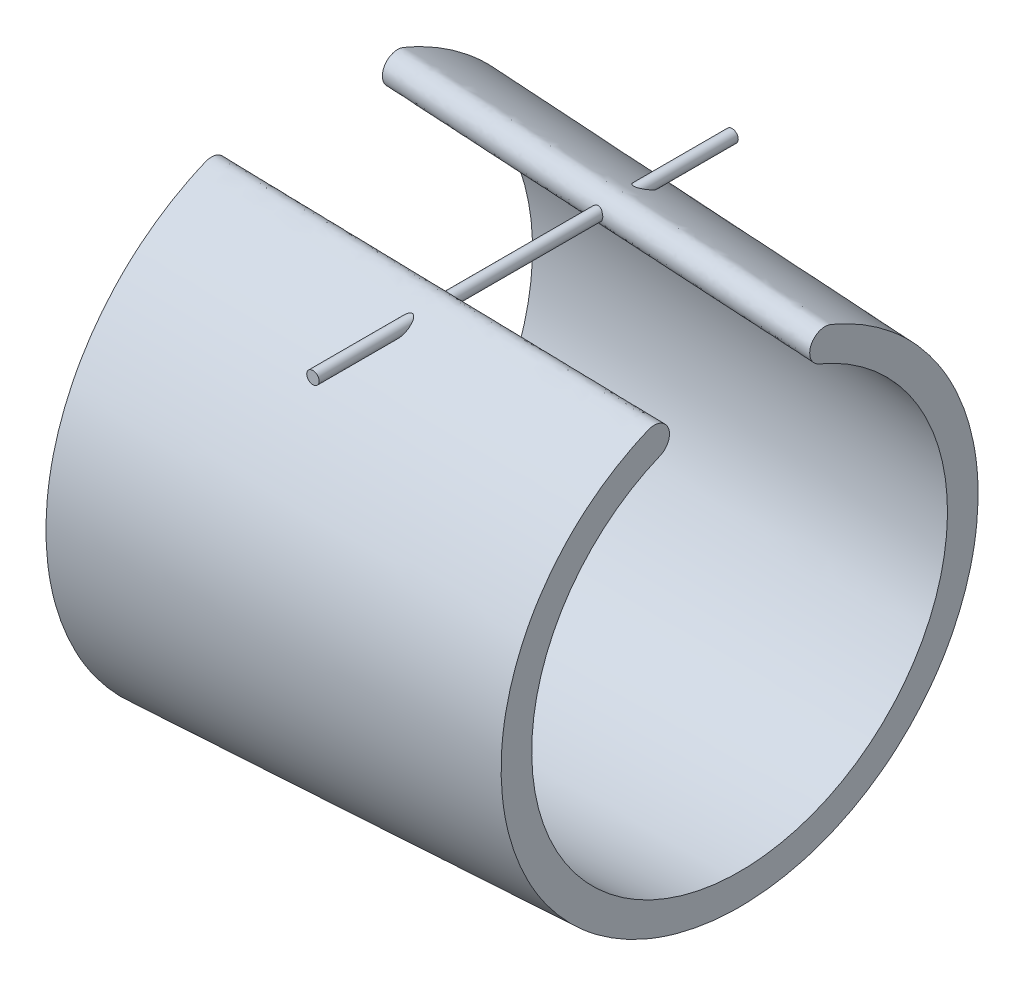
ISO-10303-21;
HEADER;
FILE_DESCRIPTION(('STEP AP214'),'2;1');
FILE_NAME('part.step','',(''),(''),'','','');
FILE_SCHEMA(('AUTOMOTIVE_DESIGN { 1 0 10303 214 1 1 1 1 }'));
ENDSEC;
DATA;
#1=APPLICATION_CONTEXT('core data for automotive mechanical design processes');
#2=APPLICATION_PROTOCOL_DEFINITION('international standard','automotive_design',2000,#1);
#3=PRODUCT_CONTEXT('',#1,'mechanical');
#4=PRODUCT('Part','Part','',(#3));
#5=PRODUCT_RELATED_PRODUCT_CATEGORY('part','',(#4));
#6=PRODUCT_DEFINITION_FORMATION('','',#4);
#7=PRODUCT_DEFINITION_CONTEXT('part definition',#1,'design');
#8=PRODUCT_DEFINITION('design','',#6,#7);
#9=PRODUCT_DEFINITION_SHAPE('','',#8);
#10=(LENGTH_UNIT() NAMED_UNIT(*) SI_UNIT(.MILLI.,.METRE.));
#11=(NAMED_UNIT(*) PLANE_ANGLE_UNIT() SI_UNIT($,.RADIAN.));
#12=(NAMED_UNIT(*) SI_UNIT($,.STERADIAN.) SOLID_ANGLE_UNIT());
#13=UNCERTAINTY_MEASURE_WITH_UNIT(LENGTH_MEASURE(1.E-05),#10,'distance_accuracy_value','');
#14=(GEOMETRIC_REPRESENTATION_CONTEXT(3) GLOBAL_UNCERTAINTY_ASSIGNED_CONTEXT((#13)) GLOBAL_UNIT_ASSIGNED_CONTEXT((#10,
#11,#12)) REPRESENTATION_CONTEXT('',''));
#15=CARTESIAN_POINT('',(0.,0.,0.));
#16=DIRECTION('',(0.,0.,1.));
#17=DIRECTION('',(1.,0.,0.));
#18=AXIS2_PLACEMENT_3D('',#15,#16,#17);
#19=CARTESIAN_POINT('',(13.208,13.1028698678518,12.7));
#20=DIRECTION('',(0.,0.,-1.));
#21=DIRECTION('',(-1.,0.,0.));
#22=AXIS2_PLACEMENT_3D('',#19,#20,#21);
#23=CYLINDRICAL_SURFACE('',#22,0.375547918929717);
#24=CARTESIAN_POINT('',(13.208,13.1028698678518,12.7));
#25=DIRECTION('',(0.,0.,1.));
#26=DIRECTION('',(1.,0.,0.));
#27=AXIS2_PLACEMENT_3D('',#24,#25,#26);
#28=CIRCLE('',#27,0.375547918929717);
#29=CARTESIAN_POINT('',(13.5835479189297,13.1028698678518,12.7));
#30=VERTEX_POINT('',#29);
#31=EDGE_CURVE('E12',#30,#30,#28,.T.);
#32=ORIENTED_EDGE('',*,*,#31,.F.);
#33=EDGE_LOOP('',(#32));
#34=FACE_BOUND('',#33,.T.);
#35=CARTESIAN_POINT('',(13.208,13.1028698678518,-12.7));
#36=DIRECTION('',(0.,0.,1.));
#37=DIRECTION('',(1.,0.,0.));
#38=AXIS2_PLACEMENT_3D('',#35,#36,#37);
#39=CIRCLE('',#38,0.375547918929717);
#40=CARTESIAN_POINT('',(13.5835479189297,13.1028698678518,-12.7));
#41=VERTEX_POINT('',#40);
#42=EDGE_CURVE('E147',#41,#41,#39,.T.);
#43=ORIENTED_EDGE('',*,*,#42,.T.);
#44=EDGE_LOOP('',(#43));
#45=FACE_BOUND('',#44,.T.);
#46=ADVANCED_FACE('F144',(#34,#45),#23,.T.);
#47=CARTESIAN_POINT('',(13.208,13.1028698678518,12.7));
#48=DIRECTION('',(0.,0.,1.));
#49=DIRECTION('',(1.,0.,0.));
#50=AXIS2_PLACEMENT_3D('',#47,#48,#49);
#51=PLANE('',#50);
#52=ORIENTED_EDGE('',*,*,#31,.T.);
#53=EDGE_LOOP('',(#52));
#54=FACE_BOUND('',#53,.T.);
#55=ADVANCED_FACE('F159',(#54),#51,.T.);
#56=CARTESIAN_POINT('',(13.208,13.1028698678518,-12.7));
#57=DIRECTION('',(0.,0.,1.));
#58=DIRECTION('',(1.,0.,0.));
#59=AXIS2_PLACEMENT_3D('',#56,#57,#58);
#60=PLANE('',#59);
#61=ORIENTED_EDGE('',*,*,#42,.F.);
#62=EDGE_LOOP('',(#61));
#63=FACE_BOUND('',#62,.T.);
#64=ADVANCED_FACE('F157',(#63),#60,.F.);
#65=CLOSED_SHELL('',(#46,#55,#64));
#66=MANIFOLD_SOLID_BREP('B2',#65);
#67=CARTESIAN_POINT('',(26.3652,6.24796630849071,-2.58799238222699));
#68=DIRECTION('',(-1.,0.,0.));
#69=DIRECTION('',(0.,0.,1.));
#70=AXIS2_PLACEMENT_3D('',#67,#68,#69);
#71=PLANE('',#70);
#72=CARTESIAN_POINT('',(26.3652,12.4959326169814,-5.17598476445399));
#73=DIRECTION('',(-1.,0.,0.));
#74=DIRECTION('',(0.,0.,1.));
#75=AXIS2_PLACEMENT_3D('',#72,#73,#74);
#76=CIRCLE('',#75,0.927099999999998);
#77=CARTESIAN_POINT('',(26.3652,11.6394039023902,-4.82119895430832));
#78=VERTEX_POINT('',#77);
#79=CARTESIAN_POINT('',(26.3652,13.3524613315726,-5.53077057459966));
#80=VERTEX_POINT('',#79);
#81=EDGE_CURVE('E239',#78,#80,#76,.T.);
#82=ORIENTED_EDGE('',*,*,#81,.F.);
#83=CARTESIAN_POINT('',(26.3652,0.,0.));
#84=DIRECTION('',(-1.,0.,0.));
#85=DIRECTION('',(0.,0.,1.));
#86=AXIS2_PLACEMENT_3D('',#83,#84,#85);
#87=CIRCLE('',#86,12.5984);
#88=CARTESIAN_POINT('',(26.3652,11.6394039023902,4.82119895430832));
#89=VERTEX_POINT('',#88);
#90=EDGE_CURVE('E142',#78,#89,#87,.T.);
#91=ORIENTED_EDGE('',*,*,#90,.T.);
#92=CARTESIAN_POINT('',(26.3652,12.4959326169814,5.17598476445399));
#93=DIRECTION('',(1.,0.,0.));
#94=DIRECTION('',(0.,0.,-1.));
#95=AXIS2_PLACEMENT_3D('',#92,#93,#94);
#96=CIRCLE('',#95,0.927099999999999);
#97=CARTESIAN_POINT('',(26.3652,13.3524613315726,5.53077057459966));
#98=VERTEX_POINT('',#97);
#99=EDGE_CURVE('E195',#89,#98,#96,.T.);
#100=ORIENTED_EDGE('',*,*,#99,.T.);
#101=CARTESIAN_POINT('',(26.3652,0.,0.));
#102=DIRECTION('',(-1.,0.,0.));
#103=DIRECTION('',(0.,0.,1.));
#104=AXIS2_PLACEMENT_3D('',#101,#102,#103);
#105=CIRCLE('',#104,14.4526);
#106=EDGE_CURVE('E315',#80,#98,#105,.T.);
#107=ORIENTED_EDGE('',*,*,#106,.F.);
#108=EDGE_LOOP('',(#82,#91,#100,#107));
#109=FACE_BOUND('',#108,.T.);
#110=ADVANCED_FACE('F184',(#109),#71,.F.);
#111=CARTESIAN_POINT('',(0.,6.81116327150958,-2.82127620259678));
#112=DIRECTION('',(-1.,0.,0.));
#113=DIRECTION('',(0.,0.,1.));
#114=AXIS2_PLACEMENT_3D('',#111,#112,#113);
#115=PLANE('',#114);
#116=CARTESIAN_POINT('',(0.,13.6223265430192,-5.64255240519355));
#117=DIRECTION('',(-1.,0.,0.));
#118=DIRECTION('',(0.,0.,1.));
#119=AXIS2_PLACEMENT_3D('',#116,#117,#118);
#120=CIRCLE('',#119,0.927099999999999);
#121=CARTESIAN_POINT('',(0.,12.765797828428,-5.28776659504788));
#122=VERTEX_POINT('',#121);
#123=CARTESIAN_POINT('',(0.,14.4788552572933,-5.99733821610462));
#124=VERTEX_POINT('',#123);
#125=EDGE_CURVE('E234',#122,#124,#120,.T.);
#126=ORIENTED_EDGE('',*,*,#125,.T.);
#127=CARTESIAN_POINT('',(0.,0.,0.));
#128=DIRECTION('',(-1.,0.,0.));
#129=DIRECTION('',(0.,0.,1.));
#130=AXIS2_PLACEMENT_3D('',#127,#128,#129);
#131=CIRCLE('',#130,15.6718);
#132=CARTESIAN_POINT('',(0.,14.4788552576046,5.99733821535325));
#133=VERTEX_POINT('',#132);
#134=EDGE_CURVE('E244',#124,#133,#131,.T.);
#135=ORIENTED_EDGE('',*,*,#134,.T.);
#136=CARTESIAN_POINT('',(0.,13.6223265430192,5.64255240519355));
#137=DIRECTION('',(1.,0.,0.));
#138=DIRECTION('',(0.,0.,-1.));
#139=AXIS2_PLACEMENT_3D('',#136,#137,#138);
#140=CIRCLE('',#139,0.927099999999998);
#141=CARTESIAN_POINT('',(0.,12.765797828428,5.28776659504788));
#142=VERTEX_POINT('',#141);
#143=EDGE_CURVE('E230',#142,#133,#140,.T.);
#144=ORIENTED_EDGE('',*,*,#143,.F.);
#145=CARTESIAN_POINT('',(0.,0.,0.));
#146=DIRECTION('',(-1.,0.,0.));
#147=DIRECTION('',(0.,0.,1.));
#148=AXIS2_PLACEMENT_3D('',#145,#146,#147);
#149=CIRCLE('',#148,13.8176);
#150=EDGE_CURVE('E226',#122,#142,#149,.T.);
#151=ORIENTED_EDGE('',*,*,#150,.F.);
#152=EDGE_LOOP('',(#126,#135,#144,#151));
#153=FACE_BOUND('',#152,.T.);
#154=ADVANCED_FACE('F243',(#153),#115,.T.);
#155=CARTESIAN_POINT('',(0.,12.7657978284747,5.28776659493496));
#156=CARTESIAN_POINT('',(26.3652,11.639403902433,4.821198954205));
#157=CARTESIAN_POINT('',(0.,12.8629813756637,5.05314475727175));
#158=CARTESIAN_POINT('',(26.3652,11.7283290601795,4.60651463233714));
#159=CARTESIAN_POINT('',(0.,13.1511834061165,4.77887323568504));
#160=CARTESIAN_POINT('',(26.3652,11.9938203677212,4.32768132566461));
#161=CARTESIAN_POINT('',(0.,13.63142158357,4.69312961095755));
#162=CARTESIAN_POINT('',(26.3652,12.4866881623338,4.22427720007977));
#163=CARTESIAN_POINT('',(0.,13.9880821768546,4.76451408538735));
#164=CARTESIAN_POINT('',(26.3652000000001,12.8584452575427,4.29519577416852));
#165=CARTESIAN_POINT('',(0.,14.28972228877,4.96730707707394));
#166=CARTESIAN_POINT('',(26.3652,13.1726384142937,4.50665103638604));
#167=CARTESIAN_POINT('',(0.,14.5667707489013,5.36784153384197));
#168=CARTESIAN_POINT('',(26.3652,13.4504303088757,4.92815139850215));
#169=CARTESIAN_POINT('',(0.,14.5755265156033,5.76395315320116));
#170=CARTESIAN_POINT('',(26.3652,13.4418578879562,5.31494819574902));
#171=CARTESIAN_POINT('',(0.,13.7928838816595,7.65341961455946));
#172=CARTESIAN_POINT('',(26.3652,12.7181106459509,7.0622286031283));
#173=CARTESIAN_POINT('',(0.,11.8472585218781,10.7286647900374));
#174=CARTESIAN_POINT('',(26.3652,10.9182088180557,9.9038303500095));
#175=CARTESIAN_POINT('',(0.,7.54345503460742,14.0911008834527));
#176=CARTESIAN_POINT('',(26.3652,6.94006743770809,13.0042862619954));
#177=CARTESIAN_POINT('',(0.,2.35704221081595,15.8087562300957));
#178=CARTESIAN_POINT('',(26.3652,2.15211284836626,14.5822344149321));
#179=CARTESIAN_POINT('',(0.,-3.1068857046069,15.6788082943042));
#180=CARTESIAN_POINT('',(26.3652,-2.88611359339689,14.454677042785));
#181=CARTESIAN_POINT('',(0.,-8.20875295279255,13.7149036513936));
#182=CARTESIAN_POINT('',(26.3652,-7.58563056608457,12.6381141842293));
#183=CARTESIAN_POINT('',(0.,-12.351147845019,10.1456836313158));
#184=CARTESIAN_POINT('',(26.3652,-11.3981710443651,9.34568881640996));
#185=CARTESIAN_POINT('',(0.,-15.0483268596937,5.38846344814443));
#186=CARTESIAN_POINT('',(26.3652,-13.8793337797875,4.96244071266712));
#187=CARTESIAN_POINT('',(0.,-15.9839865514962,0.));
#188=CARTESIAN_POINT('',(26.3652,-14.7396266878573,0.));
#189=CARTESIAN_POINT('',(0.,-15.0483268596937,-5.3884634481444));
#190=CARTESIAN_POINT('',(26.3652,-13.8793337797875,-4.96244071266701));
#191=CARTESIAN_POINT('',(0.,-12.3511478450191,-10.1456836313158));
#192=CARTESIAN_POINT('',(26.3652,-11.3981710443651,-9.34568881640993));
#193=CARTESIAN_POINT('',(0.,-8.20875295279246,-13.7149036513936));
#194=CARTESIAN_POINT('',(26.3652,-7.58563056608463,-12.6381141842292));
#195=CARTESIAN_POINT('',(0.,-3.10688570460693,-15.6788082943042));
#196=CARTESIAN_POINT('',(26.3652,-2.88611359339698,-14.454677042785));
#197=CARTESIAN_POINT('',(0.,2.35704221081595,-15.8087562300956));
#198=CARTESIAN_POINT('',(26.3652,2.15211284836617,-14.5822344149321));
#199=CARTESIAN_POINT('',(0.,7.54345503460742,-14.0911008834528));
#200=CARTESIAN_POINT('',(26.3652,6.94006743770804,-13.0042862619954));
#201=CARTESIAN_POINT('',(0.,11.8472585218781,-10.7286647900374));
#202=CARTESIAN_POINT('',(26.3652,10.9182088180557,-9.90383035000948));
#203=CARTESIAN_POINT('',(0.,13.7928838816595,-7.65341961455947));
#204=CARTESIAN_POINT('',(26.3652,12.7181106459509,-7.0622286031283));
#205=CARTESIAN_POINT('',(0.,14.5755265156033,-5.76395315320116));
#206=CARTESIAN_POINT('',(26.3652,13.4418578879562,-5.31494819574902));
#207=CARTESIAN_POINT('',(0.,14.5667707489014,-5.36784153384198));
#208=CARTESIAN_POINT('',(26.3652,13.4504303088757,-4.92815139850214));
#209=CARTESIAN_POINT('',(0.,14.28972228877,-4.96730707707393));
#210=CARTESIAN_POINT('',(26.3652,13.1726384142938,-4.50665103638604));
#211=CARTESIAN_POINT('',(0.,13.9880821768546,-4.76451408538735));
#212=CARTESIAN_POINT('',(26.3652,12.8584452575426,-4.29519577416851));
#213=CARTESIAN_POINT('',(0.,13.63142158357,-4.69312961095755));
#214=CARTESIAN_POINT('',(26.3652,12.4866881623339,-4.22427720007978));
#215=CARTESIAN_POINT('',(0.,13.1511834061165,-4.77887323568505));
#216=CARTESIAN_POINT('',(26.3652,11.9938203677212,-4.32768132566459));
#217=CARTESIAN_POINT('',(0.,12.8629813756637,-5.05314475727175));
#218=CARTESIAN_POINT('',(26.3652,11.7283290601795,-4.60651463233713));
#219=CARTESIAN_POINT('',(0.,12.1612268935028,-6.74732994556078));
#220=CARTESIAN_POINT('',(26.3652,11.086207735835,-6.15673264225867));
#221=CARTESIAN_POINT('',(0.,10.4466725627591,-9.45799267319679));
#222=CARTESIAN_POINT('',(26.3652,9.51647726408351,-8.63443834321842));
#223=CARTESIAN_POINT('',(0.,6.65318461477491,-12.4226143884596));
#224=CARTESIAN_POINT('',(26.3652,6.04749240972774,-11.3371315971417));
#225=CARTESIAN_POINT('',(0.,2.0811545151931,-13.937895235816));
#226=CARTESIAN_POINT('',(26.3652000000001,1.87317623813864,-12.7118474946034));
#227=CARTESIAN_POINT('',(0.,-2.73640511783822,-13.8243793230257));
#228=CARTESIAN_POINT('',(26.3651999999999,-2.51858154358656,-12.5996234238232));
#229=CARTESIAN_POINT('',(0.,-7.23540755023191,-12.0935914915812));
#230=CARTESIAN_POINT('',(26.3652000000001,-6.61446117331941,-11.0154266642967));
#231=CARTESIAN_POINT('',(0.,-10.8886922901926,-8.94679378943749));
#232=CARTESIAN_POINT('',(26.3652,-9.93685308145585,-8.14527960401081));
#233=CARTESIAN_POINT('',(0.,-13.2677455733886,-4.75187569562873));
#234=CARTESIAN_POINT('',(26.3652,-12.098843228352,-4.32485151229076));
#235=CARTESIAN_POINT('',(0.,-14.0929096329779,0.));
#236=CARTESIAN_POINT('',(26.3652,-12.8485430057595,0.));
#237=CARTESIAN_POINT('',(0.,-13.2677455733886,4.75187569562868));
#238=CARTESIAN_POINT('',(26.3652,-12.098843228352,4.32485151229075));
#239=CARTESIAN_POINT('',(0.,-10.8886922901926,8.94679378943745));
#240=CARTESIAN_POINT('',(26.3651999999999,-9.93685308145581,8.14527960401083));
#241=CARTESIAN_POINT('',(0.,-7.23540755023197,12.0935914915812));
#242=CARTESIAN_POINT('',(26.3652000000001,-6.61446117331941,11.0154266642966));
#243=CARTESIAN_POINT('',(0.,-2.73640511783821,13.8243793230257));
#244=CARTESIAN_POINT('',(26.3652,-2.51858154358653,12.5996234238232));
#245=CARTESIAN_POINT('',(0.,2.08115451519308,13.937895235816));
#246=CARTESIAN_POINT('',(26.3652,1.87317623813864,12.7118474946033));
#247=CARTESIAN_POINT('',(0.,6.65318461477491,12.4226143884595));
#248=CARTESIAN_POINT('',(26.3652,6.04749240972776,11.3371315971418));
#249=CARTESIAN_POINT('',(0.,10.446672562759,9.45799267319681));
#250=CARTESIAN_POINT('',(26.3652,9.5164772640835,8.6344383432184));
#251=CARTESIAN_POINT('',(0.,12.1612268935028,6.74732994556078));
#252=CARTESIAN_POINT('',(26.3652,11.086207735835,6.15673264225866));
#253=CARTESIAN_POINT('',(0.,12.7657978284747,5.28776659493496));
#254=CARTESIAN_POINT('',(26.3652,11.639403902433,4.821198954205));
#255=B_SPLINE_SURFACE_WITH_KNOTS('',3,1,((#155,#156),(#157,#158),(#159,#160),(#161,#162),(#163,
#164),(#165,#166),(#167,#168),(#169,#170),(#171,#172),(#173,#174),(#175,#176),(#177,#178),(#179,
#180),(#181,#182),(#183,#184),(#185,#186),(#187,#188),(#189,#190),(#191,#192),(#193,#194),(#195,
#196),(#197,#198),(#199,#200),(#201,#202),(#203,#204),(#205,#206),(#207,#208),(#209,#210),(#211,
#212),(#213,#214),(#215,#216),(#217,#218),(#219,#220),(#221,#222),(#223,#224),(#225,#226),(#227,
#228),(#229,#230),(#231,#232),(#233,#234),(#235,#236),(#237,#238),(#239,#240),(#241,#242),(#243,
#244),(#245,#246),(#247,#248),(#249,#250),(#251,#252),(#253,#254)),.UNSPECIFIED.,.T.,.F.,.F.,(4,
1,1,1,1,1,2,1,1,1,1,1,1,1,1,1,1,1,1,1,1,1,2,1,1,1,1,1,2,1,1,1,1,1,1,1,1,1,1,1,1,1,1,1,4),(2,2),
(0.,0.00452346649388648,0.00678519974082972,0.00904693298777297,0.0113086662347162,
0.0135703994816594,0.0180938659755459,0.0501920159431496,0.0822901659107534,0.114388315878357,
0.146486465845961,0.178584615813564,0.210682765781168,0.242780915748772,0.274879065716376,
0.306977215683979,0.339075365651583,0.371173515619187,0.40327166558679,0.435369815554394,
0.467467965521998,0.499566115489602,0.531664265457205,0.536187731951092,0.538449465198035,
0.540711198444979,0.542972931691922,0.545234664938865,0.549758131432752,0.577898248218204,
0.606038365003658,0.634178481789111,0.662318598574564,0.690458715360017,0.71859883214547,
0.746738948930923,0.774879065716376,0.803019182501829,0.831159299287282,0.859299416072735,
0.887439532858188,0.915579649643641,0.943719766429094,0.971859883214547,1.),(0.,1.),.UNSPECIFIED.);
#256=ORIENTED_EDGE('',*,*,#150,.T.);
#257=ORIENTED_EDGE('',*,*,#143,.T.);
#258=ORIENTED_EDGE('',*,*,#134,.F.);
#259=ORIENTED_EDGE('',*,*,#125,.F.);
#260=EDGE_LOOP('',(#256,#257,#258,#259));
#261=FACE_BOUND('',#260,.T.);
#262=ORIENTED_EDGE('',*,*,#81,.T.);
#263=ORIENTED_EDGE('',*,*,#106,.T.);
#264=ORIENTED_EDGE('',*,*,#99,.F.);
#265=ORIENTED_EDGE('',*,*,#90,.F.);
#266=EDGE_LOOP('',(#262,#263,#264,#265));
#267=FACE_BOUND('',#266,.T.);
#268=ADVANCED_FACE('F229',(#261,#267),#255,.T.);
#269=CLOSED_SHELL('',(#110,#154,#268));
#270=MANIFOLD_SOLID_BREP('B7',#269);
#271=ADVANCED_BREP_SHAPE_REPRESENTATION('',(#18,#66,#270),#14);
#272=SHAPE_DEFINITION_REPRESENTATION(#9,#271);
ENDSEC;
END-ISO-10303-21;
